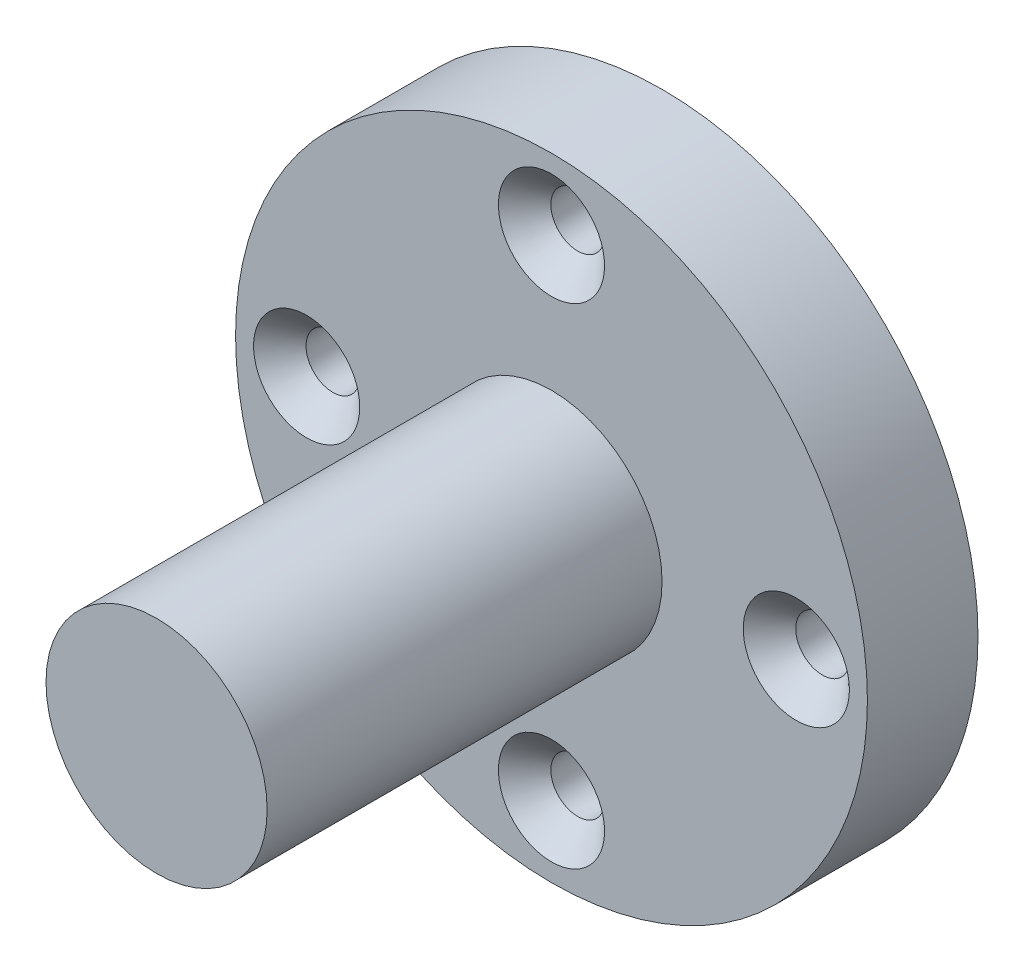
ISO-10303-21;
HEADER;
FILE_DESCRIPTION(('STEP AP214'),'2;1');
FILE_NAME('part.step','',(''),(''),'','','');
FILE_SCHEMA(('AUTOMOTIVE_DESIGN { 1 0 10303 214 1 1 1 1 }'));
ENDSEC;
DATA;
#1=APPLICATION_CONTEXT('core data for automotive mechanical design processes');
#2=APPLICATION_PROTOCOL_DEFINITION('international standard','automotive_design',2000,#1);
#3=PRODUCT_CONTEXT('',#1,'mechanical');
#4=PRODUCT('Part','Part','',(#3));
#5=PRODUCT_RELATED_PRODUCT_CATEGORY('part','',(#4));
#6=PRODUCT_DEFINITION_FORMATION('','',#4);
#7=PRODUCT_DEFINITION_CONTEXT('part definition',#1,'design');
#8=PRODUCT_DEFINITION('design','',#6,#7);
#9=PRODUCT_DEFINITION_SHAPE('','',#8);
#10=(LENGTH_UNIT() NAMED_UNIT(*) SI_UNIT(.MILLI.,.METRE.));
#11=(NAMED_UNIT(*) PLANE_ANGLE_UNIT() SI_UNIT($,.RADIAN.));
#12=(NAMED_UNIT(*) SI_UNIT($,.STERADIAN.) SOLID_ANGLE_UNIT());
#13=UNCERTAINTY_MEASURE_WITH_UNIT(LENGTH_MEASURE(1.E-05),#10,'distance_accuracy_value','');
#14=(GEOMETRIC_REPRESENTATION_CONTEXT(3) GLOBAL_UNCERTAINTY_ASSIGNED_CONTEXT((#13)) GLOBAL_UNIT_ASSIGNED_CONTEXT((#10,
#11,#12)) REPRESENTATION_CONTEXT('',''));
#15=CARTESIAN_POINT('',(0.,0.,0.));
#16=DIRECTION('',(0.,0.,1.));
#17=DIRECTION('',(1.,0.,0.));
#18=AXIS2_PLACEMENT_3D('',#15,#16,#17);
#19=CARTESIAN_POINT('',(0.,0.,7.));
#20=DIRECTION('',(0.,0.,1.));
#21=DIRECTION('',(1.,0.,0.));
#22=AXIS2_PLACEMENT_3D('',#19,#20,#21);
#23=CYLINDRICAL_SURFACE('',#22,1.69999999999999);
#24=CARTESIAN_POINT('',(0.,0.,7.));
#25=DIRECTION('',(0.,0.,1.));
#26=DIRECTION('',(1.,0.,0.));
#27=AXIS2_PLACEMENT_3D('',#24,#25,#26);
#28=CIRCLE('',#27,1.69999999999999);
#29=CARTESIAN_POINT('',(1.69999999999999,0.,7.));
#30=VERTEX_POINT('',#29);
#31=EDGE_CURVE('E84',#30,#30,#28,.F.);
#32=ORIENTED_EDGE('',*,*,#31,.F.);
#33=EDGE_LOOP('',(#32));
#34=FACE_BOUND('',#33,.T.);
#35=CARTESIAN_POINT('',(0.,0.,3.));
#36=DIRECTION('',(0.,0.,-1.));
#37=DIRECTION('',(-1.,0.,0.));
#38=AXIS2_PLACEMENT_3D('',#35,#36,#37);
#39=CIRCLE('',#38,1.69999999999999);
#40=CARTESIAN_POINT('',(-1.69999999999999,0.,3.));
#41=VERTEX_POINT('',#40);
#42=EDGE_CURVE('E34',#41,#41,#39,.F.);
#43=ORIENTED_EDGE('',*,*,#42,.F.);
#44=EDGE_LOOP('',(#43));
#45=FACE_BOUND('',#44,.T.);
#46=ADVANCED_FACE('F30',(#34,#45),#23,.F.);
#47=CARTESIAN_POINT('',(0.,0.,7.));
#48=DIRECTION('',(0.,0.,-1.));
#49=DIRECTION('',(-1.,0.,0.));
#50=AXIS2_PLACEMENT_3D('',#47,#48,#49);
#51=CYLINDRICAL_SURFACE('',#50,20.);
#52=CARTESIAN_POINT('',(0.,0.,7.));
#53=DIRECTION('',(0.,0.,1.));
#54=DIRECTION('',(1.,0.,0.));
#55=AXIS2_PLACEMENT_3D('',#52,#53,#54);
#56=CIRCLE('',#55,20.);
#57=CARTESIAN_POINT('',(20.,0.,7.));
#58=VERTEX_POINT('',#57);
#59=EDGE_CURVE('E10',#58,#58,#56,.T.);
#60=ORIENTED_EDGE('',*,*,#59,.F.);
#61=EDGE_LOOP('',(#60));
#62=FACE_BOUND('',#61,.T.);
#63=CARTESIAN_POINT('',(0.,0.,0.));
#64=DIRECTION('',(0.,0.,1.));
#65=DIRECTION('',(1.,0.,0.));
#66=AXIS2_PLACEMENT_3D('',#63,#64,#65);
#67=CIRCLE('',#66,20.);
#68=CARTESIAN_POINT('',(20.,0.,0.));
#69=VERTEX_POINT('',#68);
#70=EDGE_CURVE('E38',#69,#69,#67,.T.);
#71=ORIENTED_EDGE('',*,*,#70,.T.);
#72=EDGE_LOOP('',(#71));
#73=FACE_BOUND('',#72,.T.);
#74=ADVANCED_FACE('F32',(#62,#73),#51,.T.);
#75=CARTESIAN_POINT('',(0.,0.,7.));
#76=DIRECTION('',(0.,0.,1.));
#77=DIRECTION('',(1.,0.,0.));
#78=AXIS2_PLACEMENT_3D('',#75,#76,#77);
#79=PLANE('',#78);
#80=CARTESIAN_POINT('',(0.,0.,7.));
#81=DIRECTION('',(0.,0.,1.));
#82=DIRECTION('',(1.,0.,0.));
#83=AXIS2_PLACEMENT_3D('',#80,#81,#82);
#84=CIRCLE('',#83,7.);
#85=CARTESIAN_POINT('',(7.,0.,7.));
#86=VERTEX_POINT('',#85);
#87=EDGE_CURVE('E90',#86,#86,#84,.T.);
#88=ORIENTED_EDGE('',*,*,#87,.F.);
#89=EDGE_LOOP('',(#88));
#90=FACE_BOUND('',#89,.T.);
#91=CARTESIAN_POINT('',(0.,15.5,7.));
#92=DIRECTION('',(0.,0.,1.));
#93=DIRECTION('',(1.,0.,0.));
#94=AXIS2_PLACEMENT_3D('',#91,#92,#93);
#95=CIRCLE('',#94,3.36);
#96=CARTESIAN_POINT('',(3.36,15.5,7.));
#97=VERTEX_POINT('',#96);
#98=EDGE_CURVE('E77',#97,#97,#95,.T.);
#99=ORIENTED_EDGE('',*,*,#98,.F.);
#100=EDGE_LOOP('',(#99));
#101=FACE_BOUND('',#100,.T.);
#102=CARTESIAN_POINT('',(15.5000000000004,3.6609757468135E-13,7.));
#103=DIRECTION('',(0.,0.,1.));
#104=DIRECTION('',(1.,0.,0.));
#105=AXIS2_PLACEMENT_3D('',#102,#103,#104);
#106=CIRCLE('',#105,3.36);
#107=CARTESIAN_POINT('',(18.8600000000004,3.6609757468135E-13,7.));
#108=VERTEX_POINT('',#107);
#109=EDGE_CURVE('E68',#108,#108,#106,.T.);
#110=ORIENTED_EDGE('',*,*,#109,.F.);
#111=EDGE_LOOP('',(#110));
#112=FACE_BOUND('',#111,.T.);
#113=CARTESIAN_POINT('',(7.32195149362699E-13,-15.5,7.));
#114=DIRECTION('',(0.,0.,1.));
#115=DIRECTION('',(1.,0.,0.));
#116=AXIS2_PLACEMENT_3D('',#113,#114,#115);
#117=CIRCLE('',#116,3.36);
#118=CARTESIAN_POINT('',(3.36000000000073,-15.5,7.));
#119=VERTEX_POINT('',#118);
#120=EDGE_CURVE('E59',#119,#119,#117,.T.);
#121=ORIENTED_EDGE('',*,*,#120,.F.);
#122=EDGE_LOOP('',(#121));
#123=FACE_BOUND('',#122,.T.);
#124=CARTESIAN_POINT('',(-15.4999999999996,-3.64199372142671E-13,7.));
#125=DIRECTION('',(0.,0.,1.));
#126=DIRECTION('',(1.,0.,0.));
#127=AXIS2_PLACEMENT_3D('',#124,#125,#126);
#128=CIRCLE('',#127,3.36);
#129=CARTESIAN_POINT('',(-12.1399999999996,-3.64199372142671E-13,7.));
#130=VERTEX_POINT('',#129);
#131=EDGE_CURVE('E50',#130,#130,#128,.T.);
#132=ORIENTED_EDGE('',*,*,#131,.F.);
#133=EDGE_LOOP('',(#132));
#134=FACE_BOUND('',#133,.T.);
#135=ORIENTED_EDGE('',*,*,#59,.T.);
#136=EDGE_LOOP('',(#135));
#137=FACE_BOUND('',#136,.T.);
#138=ADVANCED_FACE('F105',(#90,#101,#112,#123,#134,#137),#79,.T.);
#139=CARTESIAN_POINT('',(0.,0.,0.));
#140=DIRECTION('',(0.,0.,1.));
#141=DIRECTION('',(1.,0.,0.));
#142=AXIS2_PLACEMENT_3D('',#139,#140,#141);
#143=PLANE('',#142);
#144=CARTESIAN_POINT('',(0.,0.,0.));
#145=DIRECTION('',(0.,0.,-1.));
#146=DIRECTION('',(-1.,0.,0.));
#147=AXIS2_PLACEMENT_3D('',#144,#145,#146);
#148=CIRCLE('',#147,5.);
#149=CARTESIAN_POINT('',(-5.,0.,0.));
#150=VERTEX_POINT('',#149);
#151=EDGE_CURVE('E80',#150,#150,#148,.T.);
#152=ORIENTED_EDGE('',*,*,#151,.F.);
#153=EDGE_LOOP('',(#152));
#154=FACE_BOUND('',#153,.T.);
#155=CARTESIAN_POINT('',(0.,15.5,0.));
#156=DIRECTION('',(0.,0.,1.));
#157=DIRECTION('',(1.,0.,0.));
#158=AXIS2_PLACEMENT_3D('',#155,#156,#157);
#159=CIRCLE('',#158,1.7);
#160=CARTESIAN_POINT('',(1.7,15.5,0.));
#161=VERTEX_POINT('',#160);
#162=EDGE_CURVE('E71',#161,#161,#159,.T.);
#163=ORIENTED_EDGE('',*,*,#162,.T.);
#164=EDGE_LOOP('',(#163));
#165=FACE_BOUND('',#164,.T.);
#166=CARTESIAN_POINT('',(15.5000000000004,3.6609757468135E-13,0.));
#167=DIRECTION('',(0.,0.,1.));
#168=DIRECTION('',(1.,0.,0.));
#169=AXIS2_PLACEMENT_3D('',#166,#167,#168);
#170=CIRCLE('',#169,1.7);
#171=CARTESIAN_POINT('',(17.2000000000004,3.6609757468135E-13,0.));
#172=VERTEX_POINT('',#171);
#173=EDGE_CURVE('E62',#172,#172,#170,.T.);
#174=ORIENTED_EDGE('',*,*,#173,.T.);
#175=EDGE_LOOP('',(#174));
#176=FACE_BOUND('',#175,.T.);
#177=CARTESIAN_POINT('',(7.32195149362699E-13,-15.5,0.));
#178=DIRECTION('',(0.,0.,1.));
#179=DIRECTION('',(1.,0.,0.));
#180=AXIS2_PLACEMENT_3D('',#177,#178,#179);
#181=CIRCLE('',#180,1.7);
#182=CARTESIAN_POINT('',(1.70000000000073,-15.5,0.));
#183=VERTEX_POINT('',#182);
#184=EDGE_CURVE('E53',#183,#183,#181,.T.);
#185=ORIENTED_EDGE('',*,*,#184,.T.);
#186=EDGE_LOOP('',(#185));
#187=FACE_BOUND('',#186,.T.);
#188=CARTESIAN_POINT('',(-15.4999999999996,-3.64199372142671E-13,0.));
#189=DIRECTION('',(0.,0.,1.));
#190=DIRECTION('',(1.,0.,0.));
#191=AXIS2_PLACEMENT_3D('',#188,#189,#190);
#192=CIRCLE('',#191,1.7);
#193=CARTESIAN_POINT('',(-13.7999999999996,-3.64199372142671E-13,0.));
#194=VERTEX_POINT('',#193);
#195=EDGE_CURVE('E43',#194,#194,#192,.T.);
#196=ORIENTED_EDGE('',*,*,#195,.T.);
#197=EDGE_LOOP('',(#196));
#198=FACE_BOUND('',#197,.T.);
#199=ORIENTED_EDGE('',*,*,#70,.F.);
#200=EDGE_LOOP('',(#199));
#201=FACE_BOUND('',#200,.T.);
#202=ADVANCED_FACE('F108',(#154,#165,#176,#187,#198,#201),#143,.F.);
#203=CARTESIAN_POINT('',(-15.4999999999996,-3.64199372142671E-13,7.));
#204=DIRECTION('',(0.,0.,1.));
#205=DIRECTION('',(1.,0.,0.));
#206=AXIS2_PLACEMENT_3D('',#203,#204,#205);
#207=CYLINDRICAL_SURFACE('',#206,1.7);
#208=ORIENTED_EDGE('',*,*,#195,.F.);
#209=EDGE_LOOP('',(#208));
#210=FACE_BOUND('',#209,.T.);
#211=CARTESIAN_POINT('',(-15.4999999999996,-3.64199372142671E-13,5.34));
#212=DIRECTION('',(0.,0.,1.));
#213=DIRECTION('',(1.,0.,0.));
#214=AXIS2_PLACEMENT_3D('',#211,#212,#213);
#215=CIRCLE('',#214,1.7);
#216=CARTESIAN_POINT('',(-13.7999999999996,-3.64199372142671E-13,5.34));
#217=VERTEX_POINT('',#216);
#218=EDGE_CURVE('E47',#217,#217,#215,.T.);
#219=ORIENTED_EDGE('',*,*,#218,.T.);
#220=EDGE_LOOP('',(#219));
#221=FACE_BOUND('',#220,.T.);
#222=ADVANCED_FACE('F121',(#210,#221),#207,.F.);
#223=CARTESIAN_POINT('',(-15.4999999999996,-3.64199372142671E-13,7.));
#224=DIRECTION('',(0.,0.,1.));
#225=DIRECTION('',(1.,0.,0.));
#226=AXIS2_PLACEMENT_3D('',#223,#224,#225);
#227=CONICAL_SURFACE('',#226,3.36,0.785398163397449);
#228=ORIENTED_EDGE('',*,*,#218,.F.);
#229=EDGE_LOOP('',(#228));
#230=FACE_BOUND('',#229,.T.);
#231=ORIENTED_EDGE('',*,*,#131,.T.);
#232=EDGE_LOOP('',(#231));
#233=FACE_BOUND('',#232,.T.);
#234=ADVANCED_FACE('F118',(#230,#233),#227,.F.);
#235=CARTESIAN_POINT('',(7.32195149362699E-13,-15.5,7.));
#236=DIRECTION('',(0.,0.,1.));
#237=DIRECTION('',(1.,0.,0.));
#238=AXIS2_PLACEMENT_3D('',#235,#236,#237);
#239=CYLINDRICAL_SURFACE('',#238,1.7);
#240=ORIENTED_EDGE('',*,*,#184,.F.);
#241=EDGE_LOOP('',(#240));
#242=FACE_BOUND('',#241,.T.);
#243=CARTESIAN_POINT('',(7.32195149362699E-13,-15.5,5.34));
#244=DIRECTION('',(0.,0.,1.));
#245=DIRECTION('',(1.,0.,0.));
#246=AXIS2_PLACEMENT_3D('',#243,#244,#245);
#247=CIRCLE('',#246,1.7);
#248=CARTESIAN_POINT('',(1.70000000000073,-15.5,5.34));
#249=VERTEX_POINT('',#248);
#250=EDGE_CURVE('E56',#249,#249,#247,.T.);
#251=ORIENTED_EDGE('',*,*,#250,.T.);
#252=EDGE_LOOP('',(#251));
#253=FACE_BOUND('',#252,.T.);
#254=ADVANCED_FACE('F120',(#242,#253),#239,.F.);
#255=CARTESIAN_POINT('',(7.32195149362699E-13,-15.5,7.));
#256=DIRECTION('',(0.,0.,1.));
#257=DIRECTION('',(1.,0.,0.));
#258=AXIS2_PLACEMENT_3D('',#255,#256,#257);
#259=CONICAL_SURFACE('',#258,3.36,0.785398163397449);
#260=ORIENTED_EDGE('',*,*,#250,.F.);
#261=EDGE_LOOP('',(#260));
#262=FACE_BOUND('',#261,.T.);
#263=ORIENTED_EDGE('',*,*,#120,.T.);
#264=EDGE_LOOP('',(#263));
#265=FACE_BOUND('',#264,.T.);
#266=ADVANCED_FACE('F128',(#262,#265),#259,.F.);
#267=CARTESIAN_POINT('',(15.5000000000004,3.6609757468135E-13,7.));
#268=DIRECTION('',(0.,0.,1.));
#269=DIRECTION('',(1.,0.,0.));
#270=AXIS2_PLACEMENT_3D('',#267,#268,#269);
#271=CYLINDRICAL_SURFACE('',#270,1.7);
#272=ORIENTED_EDGE('',*,*,#173,.F.);
#273=EDGE_LOOP('',(#272));
#274=FACE_BOUND('',#273,.T.);
#275=CARTESIAN_POINT('',(15.5000000000004,3.6609757468135E-13,5.34));
#276=DIRECTION('',(0.,0.,1.));
#277=DIRECTION('',(1.,0.,0.));
#278=AXIS2_PLACEMENT_3D('',#275,#276,#277);
#279=CIRCLE('',#278,1.7);
#280=CARTESIAN_POINT('',(17.2000000000004,3.6609757468135E-13,5.34));
#281=VERTEX_POINT('',#280);
#282=EDGE_CURVE('E65',#281,#281,#279,.T.);
#283=ORIENTED_EDGE('',*,*,#282,.T.);
#284=EDGE_LOOP('',(#283));
#285=FACE_BOUND('',#284,.T.);
#286=ADVANCED_FACE('F159',(#274,#285),#271,.F.);
#287=CARTESIAN_POINT('',(15.5000000000004,3.6609757468135E-13,7.));
#288=DIRECTION('',(0.,0.,1.));
#289=DIRECTION('',(1.,0.,0.));
#290=AXIS2_PLACEMENT_3D('',#287,#288,#289);
#291=CONICAL_SURFACE('',#290,3.36,0.785398163397449);
#292=ORIENTED_EDGE('',*,*,#282,.F.);
#293=EDGE_LOOP('',(#292));
#294=FACE_BOUND('',#293,.T.);
#295=ORIENTED_EDGE('',*,*,#109,.T.);
#296=EDGE_LOOP('',(#295));
#297=FACE_BOUND('',#296,.T.);
#298=ADVANCED_FACE('F155',(#294,#297),#291,.F.);
#299=CARTESIAN_POINT('',(0.,15.5,7.));
#300=DIRECTION('',(0.,0.,1.));
#301=DIRECTION('',(1.,0.,0.));
#302=AXIS2_PLACEMENT_3D('',#299,#300,#301);
#303=CYLINDRICAL_SURFACE('',#302,1.7);
#304=ORIENTED_EDGE('',*,*,#162,.F.);
#305=EDGE_LOOP('',(#304));
#306=FACE_BOUND('',#305,.T.);
#307=CARTESIAN_POINT('',(0.,15.5,5.34));
#308=DIRECTION('',(0.,0.,1.));
#309=DIRECTION('',(1.,0.,0.));
#310=AXIS2_PLACEMENT_3D('',#307,#308,#309);
#311=CIRCLE('',#310,1.7);
#312=CARTESIAN_POINT('',(1.7,15.5,5.34));
#313=VERTEX_POINT('',#312);
#314=EDGE_CURVE('E74',#313,#313,#311,.T.);
#315=ORIENTED_EDGE('',*,*,#314,.T.);
#316=EDGE_LOOP('',(#315));
#317=FACE_BOUND('',#316,.T.);
#318=ADVANCED_FACE('F151',(#306,#317),#303,.F.);
#319=CARTESIAN_POINT('',(0.,15.5,7.));
#320=DIRECTION('',(0.,0.,1.));
#321=DIRECTION('',(1.,0.,0.));
#322=AXIS2_PLACEMENT_3D('',#319,#320,#321);
#323=CONICAL_SURFACE('',#322,3.36,0.785398163397449);
#324=ORIENTED_EDGE('',*,*,#314,.F.);
#325=EDGE_LOOP('',(#324));
#326=FACE_BOUND('',#325,.T.);
#327=ORIENTED_EDGE('',*,*,#98,.T.);
#328=EDGE_LOOP('',(#327));
#329=FACE_BOUND('',#328,.T.);
#330=ADVANCED_FACE('F147',(#326,#329),#323,.F.);
#331=CARTESIAN_POINT('',(0.,0.,3.));
#332=DIRECTION('',(0.,0.,-1.));
#333=DIRECTION('',(-1.,0.,0.));
#334=AXIS2_PLACEMENT_3D('',#331,#332,#333);
#335=PLANE('',#334);
#336=CARTESIAN_POINT('',(0.,0.,3.));
#337=DIRECTION('',(0.,0.,-1.));
#338=DIRECTION('',(-1.,0.,0.));
#339=AXIS2_PLACEMENT_3D('',#336,#337,#338);
#340=CIRCLE('',#339,5.);
#341=CARTESIAN_POINT('',(-5.,0.,3.));
#342=VERTEX_POINT('',#341);
#343=EDGE_CURVE('E83',#342,#342,#340,.T.);
#344=ORIENTED_EDGE('',*,*,#343,.T.);
#345=EDGE_LOOP('',(#344));
#346=FACE_BOUND('',#345,.T.);
#347=ORIENTED_EDGE('',*,*,#42,.T.);
#348=EDGE_LOOP('',(#347));
#349=FACE_BOUND('',#348,.T.);
#350=ADVANCED_FACE('F150',(#346,#349),#335,.T.);
#351=CARTESIAN_POINT('',(0.,0.,3.));
#352=DIRECTION('',(0.,0.,-1.));
#353=DIRECTION('',(-1.,0.,0.));
#354=AXIS2_PLACEMENT_3D('',#351,#352,#353);
#355=CYLINDRICAL_SURFACE('',#354,5.);
#356=ORIENTED_EDGE('',*,*,#343,.F.);
#357=EDGE_LOOP('',(#356));
#358=FACE_BOUND('',#357,.T.);
#359=ORIENTED_EDGE('',*,*,#151,.T.);
#360=EDGE_LOOP('',(#359));
#361=FACE_BOUND('',#360,.T.);
#362=ADVANCED_FACE('F145',(#358,#361),#355,.F.);
#363=CARTESIAN_POINT('',(0.,0.,32.));
#364=DIRECTION('',(0.,0.,1.));
#365=DIRECTION('',(1.,0.,0.));
#366=AXIS2_PLACEMENT_3D('',#363,#364,#365);
#367=PLANE('',#366);
#368=CARTESIAN_POINT('',(0.,0.,32.));
#369=DIRECTION('',(0.,0.,1.));
#370=DIRECTION('',(1.,0.,0.));
#371=AXIS2_PLACEMENT_3D('',#368,#369,#370);
#372=CIRCLE('',#371,7.);
#373=CARTESIAN_POINT('',(7.,0.,32.));
#374=VERTEX_POINT('',#373);
#375=EDGE_CURVE('E89',#374,#374,#372,.T.);
#376=ORIENTED_EDGE('',*,*,#375,.T.);
#377=EDGE_LOOP('',(#376));
#378=FACE_BOUND('',#377,.T.);
#379=ADVANCED_FACE('F96',(#378),#367,.T.);
#380=CARTESIAN_POINT('',(0.,0.,32.));
#381=DIRECTION('',(0.,0.,-1.));
#382=DIRECTION('',(-1.,0.,0.));
#383=AXIS2_PLACEMENT_3D('',#380,#381,#382);
#384=CYLINDRICAL_SURFACE('',#383,7.);
#385=ORIENTED_EDGE('',*,*,#375,.F.);
#386=EDGE_LOOP('',(#385));
#387=FACE_BOUND('',#386,.T.);
#388=ORIENTED_EDGE('',*,*,#87,.T.);
#389=EDGE_LOOP('',(#388));
#390=FACE_BOUND('',#389,.T.);
#391=ADVANCED_FACE('F98',(#387,#390),#384,.T.);
#392=CARTESIAN_POINT('',(0.,0.,7.));
#393=DIRECTION('',(0.,0.,1.));
#394=DIRECTION('',(1.,0.,0.));
#395=AXIS2_PLACEMENT_3D('',#392,#393,#394);
#396=PLANE('',#395);
#397=ORIENTED_EDGE('',*,*,#31,.T.);
#398=EDGE_LOOP('',(#397));
#399=FACE_BOUND('',#398,.T.);
#400=ADVANCED_FACE('F101',(#399),#396,.F.);
#401=CLOSED_SHELL('',(#46,#74,#138,#202,#222,#234,#254,#266,#286,#298,#318,#330,#350,#362,#379,
#391,#400));
#402=MANIFOLD_SOLID_BREP('B2',#401);
#403=ADVANCED_BREP_SHAPE_REPRESENTATION('',(#18,#402),#14);
#404=SHAPE_DEFINITION_REPRESENTATION(#9,#403);
ENDSEC;
END-ISO-10303-21;
